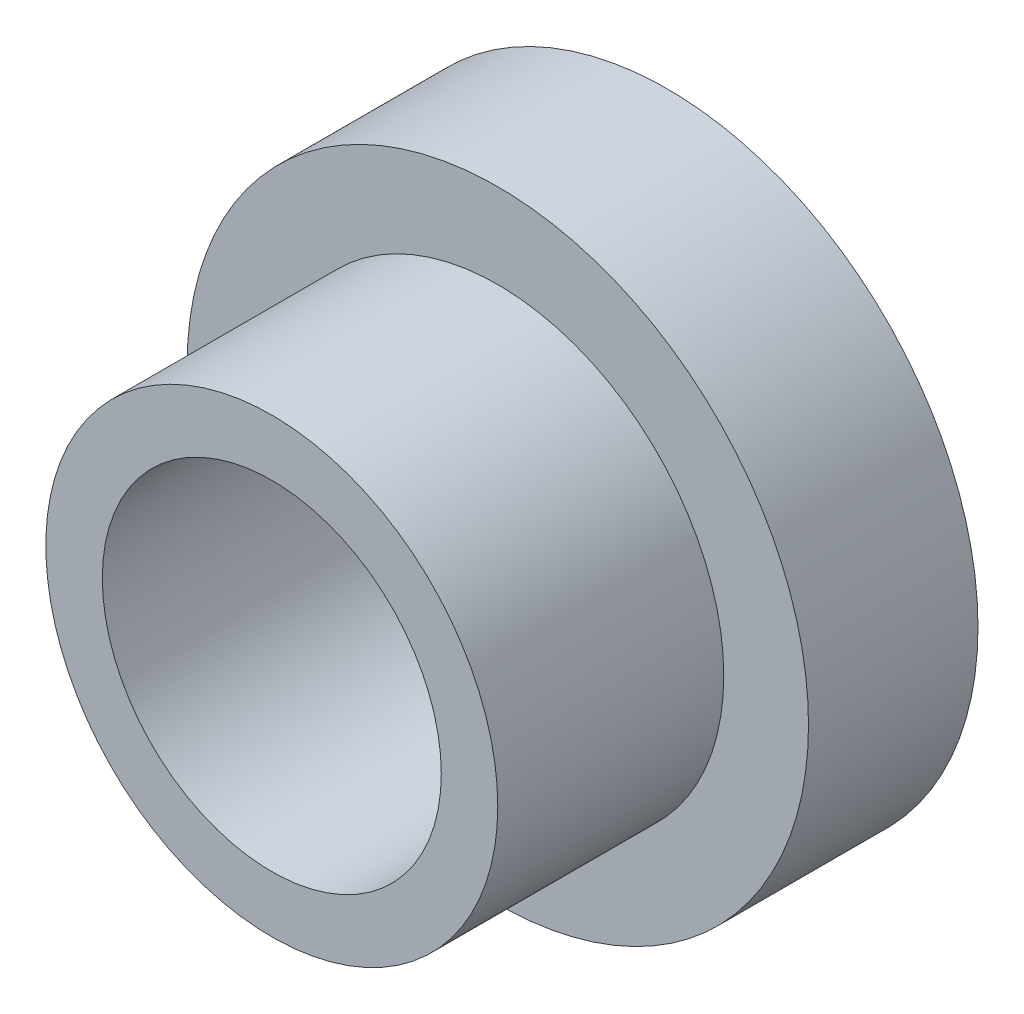
ISO-10303-21;
HEADER;
FILE_DESCRIPTION(('STEP AP214'),'2;1');
FILE_NAME('part.step','',(''),(''),'','','');
FILE_SCHEMA(('AUTOMOTIVE_DESIGN { 1 0 10303 214 1 1 1 1 }'));
ENDSEC;
DATA;
#1=APPLICATION_CONTEXT('core data for automotive mechanical design processes');
#2=APPLICATION_PROTOCOL_DEFINITION('international standard','automotive_design',2000,#1);
#3=PRODUCT_CONTEXT('',#1,'mechanical');
#4=PRODUCT('Part','Part','',(#3));
#5=PRODUCT_RELATED_PRODUCT_CATEGORY('part','',(#4));
#6=PRODUCT_DEFINITION_FORMATION('','',#4);
#7=PRODUCT_DEFINITION_CONTEXT('part definition',#1,'design');
#8=PRODUCT_DEFINITION('design','',#6,#7);
#9=PRODUCT_DEFINITION_SHAPE('','',#8);
#10=(LENGTH_UNIT() NAMED_UNIT(*) SI_UNIT(.MILLI.,.METRE.));
#11=(NAMED_UNIT(*) PLANE_ANGLE_UNIT() SI_UNIT($,.RADIAN.));
#12=(NAMED_UNIT(*) SI_UNIT($,.STERADIAN.) SOLID_ANGLE_UNIT());
#13=UNCERTAINTY_MEASURE_WITH_UNIT(LENGTH_MEASURE(1.E-05),#10,'distance_accuracy_value','');
#14=(GEOMETRIC_REPRESENTATION_CONTEXT(3) GLOBAL_UNCERTAINTY_ASSIGNED_CONTEXT((#13)) GLOBAL_UNIT_ASSIGNED_CONTEXT((#10,
#11,#12)) REPRESENTATION_CONTEXT('',''));
#15=CARTESIAN_POINT('',(0.,0.,0.));
#16=DIRECTION('',(0.,0.,1.));
#17=DIRECTION('',(1.,0.,0.));
#18=AXIS2_PLACEMENT_3D('',#15,#16,#17);
#19=CARTESIAN_POINT('',(0.,0.,3.));
#20=DIRECTION('',(0.,0.,1.));
#21=DIRECTION('',(1.,0.,0.));
#22=AXIS2_PLACEMENT_3D('',#19,#20,#21);
#23=PLANE('',#22);
#24=CARTESIAN_POINT('',(0.,0.,3.));
#25=DIRECTION('',(0.,0.,1.));
#26=DIRECTION('',(1.,0.,0.));
#27=AXIS2_PLACEMENT_3D('',#24,#25,#26);
#28=CIRCLE('',#27,5.5);
#29=CARTESIAN_POINT('',(5.5,0.,3.));
#30=VERTEX_POINT('',#29);
#31=EDGE_CURVE('E10',#30,#30,#28,.T.);
#32=ORIENTED_EDGE('',*,*,#31,.T.);
#33=EDGE_LOOP('',(#32));
#34=FACE_BOUND('',#33,.T.);
#35=CARTESIAN_POINT('',(0.,0.,3.));
#36=DIRECTION('',(0.,0.,1.));
#37=DIRECTION('',(1.,0.,0.));
#38=AXIS2_PLACEMENT_3D('',#35,#36,#37);
#39=CIRCLE('',#38,4.);
#40=CARTESIAN_POINT('',(4.,0.,3.));
#41=VERTEX_POINT('',#40);
#42=EDGE_CURVE('E42',#41,#41,#39,.T.);
#43=ORIENTED_EDGE('',*,*,#42,.F.);
#44=EDGE_LOOP('',(#43));
#45=FACE_BOUND('',#44,.T.);
#46=ADVANCED_FACE('F27',(#34,#45),#23,.T.);
#47=CARTESIAN_POINT('',(0.,0.,3.));
#48=DIRECTION('',(0.,0.,-1.));
#49=DIRECTION('',(-1.,0.,0.));
#50=AXIS2_PLACEMENT_3D('',#47,#48,#49);
#51=CYLINDRICAL_SURFACE('',#50,5.5);
#52=ORIENTED_EDGE('',*,*,#31,.F.);
#53=EDGE_LOOP('',(#52));
#54=FACE_BOUND('',#53,.T.);
#55=CARTESIAN_POINT('',(0.,0.,0.));
#56=DIRECTION('',(0.,0.,1.));
#57=DIRECTION('',(1.,0.,0.));
#58=AXIS2_PLACEMENT_3D('',#55,#56,#57);
#59=CIRCLE('',#58,5.5);
#60=CARTESIAN_POINT('',(5.5,0.,0.));
#61=VERTEX_POINT('',#60);
#62=EDGE_CURVE('E34',#61,#61,#59,.T.);
#63=ORIENTED_EDGE('',*,*,#62,.T.);
#64=EDGE_LOOP('',(#63));
#65=FACE_BOUND('',#64,.T.);
#66=ADVANCED_FACE('F29',(#54,#65),#51,.T.);
#67=CARTESIAN_POINT('',(0.,0.,0.));
#68=DIRECTION('',(0.,0.,1.));
#69=DIRECTION('',(1.,0.,0.));
#70=AXIS2_PLACEMENT_3D('',#67,#68,#69);
#71=PLANE('',#70);
#72=CARTESIAN_POINT('',(0.,0.,0.));
#73=DIRECTION('',(0.,0.,1.));
#74=DIRECTION('',(1.,0.,0.));
#75=AXIS2_PLACEMENT_3D('',#72,#73,#74);
#76=CIRCLE('',#75,3.);
#77=CARTESIAN_POINT('',(3.,0.,0.));
#78=VERTEX_POINT('',#77);
#79=EDGE_CURVE('E47',#78,#78,#76,.T.);
#80=ORIENTED_EDGE('',*,*,#79,.T.);
#81=EDGE_LOOP('',(#80));
#82=FACE_BOUND('',#81,.T.);
#83=ORIENTED_EDGE('',*,*,#62,.F.);
#84=EDGE_LOOP('',(#83));
#85=FACE_BOUND('',#84,.T.);
#86=ADVANCED_FACE('F65',(#82,#85),#71,.F.);
#87=CARTESIAN_POINT('',(0.,0.,7.));
#88=DIRECTION('',(0.,0.,-1.));
#89=DIRECTION('',(-1.,0.,0.));
#90=AXIS2_PLACEMENT_3D('',#87,#88,#89);
#91=CYLINDRICAL_SURFACE('',#90,4.);
#92=CARTESIAN_POINT('',(0.,0.,7.));
#93=DIRECTION('',(0.,0.,1.));
#94=DIRECTION('',(1.,0.,0.));
#95=AXIS2_PLACEMENT_3D('',#92,#93,#94);
#96=CIRCLE('',#95,4.);
#97=CARTESIAN_POINT('',(4.,0.,7.));
#98=VERTEX_POINT('',#97);
#99=EDGE_CURVE('E38',#98,#98,#96,.T.);
#100=ORIENTED_EDGE('',*,*,#99,.F.);
#101=EDGE_LOOP('',(#100));
#102=FACE_BOUND('',#101,.T.);
#103=ORIENTED_EDGE('',*,*,#42,.T.);
#104=EDGE_LOOP('',(#103));
#105=FACE_BOUND('',#104,.T.);
#106=ADVANCED_FACE('F59',(#102,#105),#91,.T.);
#107=CARTESIAN_POINT('',(0.,0.,7.));
#108=DIRECTION('',(0.,0.,1.));
#109=DIRECTION('',(1.,0.,0.));
#110=AXIS2_PLACEMENT_3D('',#107,#108,#109);
#111=PLANE('',#110);
#112=CARTESIAN_POINT('',(0.,0.,7.));
#113=DIRECTION('',(0.,0.,1.));
#114=DIRECTION('',(1.,0.,0.));
#115=AXIS2_PLACEMENT_3D('',#112,#113,#114);
#116=CIRCLE('',#115,3.);
#117=CARTESIAN_POINT('',(3.,0.,7.));
#118=VERTEX_POINT('',#117);
#119=EDGE_CURVE('E50',#118,#118,#116,.T.);
#120=ORIENTED_EDGE('',*,*,#119,.F.);
#121=EDGE_LOOP('',(#120));
#122=FACE_BOUND('',#121,.T.);
#123=ORIENTED_EDGE('',*,*,#99,.T.);
#124=EDGE_LOOP('',(#123));
#125=FACE_BOUND('',#124,.T.);
#126=ADVANCED_FACE('F56',(#122,#125),#111,.T.);
#127=CARTESIAN_POINT('',(0.,0.,0.));
#128=DIRECTION('',(0.,0.,1.));
#129=DIRECTION('',(1.,0.,0.));
#130=AXIS2_PLACEMENT_3D('',#127,#128,#129);
#131=CYLINDRICAL_SURFACE('',#130,3.);
#132=ORIENTED_EDGE('',*,*,#79,.F.);
#133=EDGE_LOOP('',(#132));
#134=FACE_BOUND('',#133,.T.);
#135=ORIENTED_EDGE('',*,*,#119,.T.);
#136=EDGE_LOOP('',(#135));
#137=FACE_BOUND('',#136,.T.);
#138=ADVANCED_FACE('F54',(#134,#137),#131,.F.);
#139=CLOSED_SHELL('',(#46,#66,#86,#106,#126,#138));
#140=MANIFOLD_SOLID_BREP('B2',#139);
#141=ADVANCED_BREP_SHAPE_REPRESENTATION('',(#18,#140),#14);
#142=SHAPE_DEFINITION_REPRESENTATION(#9,#141);
ENDSEC;
END-ISO-10303-21;
